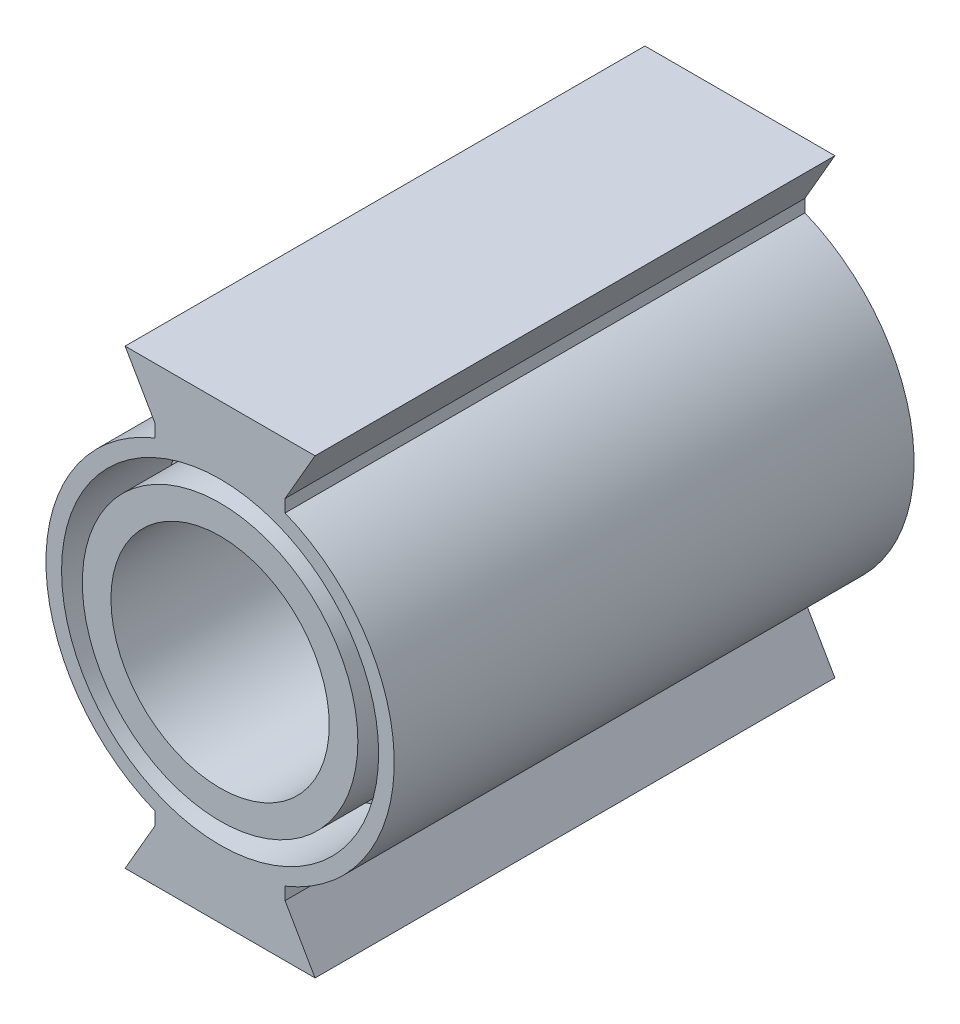
ISO-10303-21;
HEADER;
FILE_DESCRIPTION(('STEP AP214'),'2;1');
FILE_NAME('part.step','',(''),(''),'','','');
FILE_SCHEMA(('AUTOMOTIVE_DESIGN { 1 0 10303 214 1 1 1 1 }'));
ENDSEC;
DATA;
#1=APPLICATION_CONTEXT('core data for automotive mechanical design processes');
#2=APPLICATION_PROTOCOL_DEFINITION('international standard','automotive_design',2000,#1);
#3=PRODUCT_CONTEXT('',#1,'mechanical');
#4=PRODUCT('Part','Part','',(#3));
#5=PRODUCT_RELATED_PRODUCT_CATEGORY('part','',(#4));
#6=PRODUCT_DEFINITION_FORMATION('','',#4);
#7=PRODUCT_DEFINITION_CONTEXT('part definition',#1,'design');
#8=PRODUCT_DEFINITION('design','',#6,#7);
#9=PRODUCT_DEFINITION_SHAPE('','',#8);
#10=(LENGTH_UNIT() NAMED_UNIT(*) SI_UNIT(.MILLI.,.METRE.));
#11=(NAMED_UNIT(*) PLANE_ANGLE_UNIT() SI_UNIT($,.RADIAN.));
#12=(NAMED_UNIT(*) SI_UNIT($,.STERADIAN.) SOLID_ANGLE_UNIT());
#13=UNCERTAINTY_MEASURE_WITH_UNIT(LENGTH_MEASURE(1.E-05),#10,'distance_accuracy_value','');
#14=(GEOMETRIC_REPRESENTATION_CONTEXT(3) GLOBAL_UNCERTAINTY_ASSIGNED_CONTEXT((#13)) GLOBAL_UNIT_ASSIGNED_CONTEXT((#10,
#11,#12)) REPRESENTATION_CONTEXT('',''));
#15=CARTESIAN_POINT('',(0.,0.,0.));
#16=DIRECTION('',(0.,0.,1.));
#17=DIRECTION('',(1.,0.,0.));
#18=AXIS2_PLACEMENT_3D('',#15,#16,#17);
#19=CARTESIAN_POINT('',(0.,0.,25.4));
#20=DIRECTION('',(0.,0.,-1.));
#21=DIRECTION('',(-1.,0.,0.));
#22=AXIS2_PLACEMENT_3D('',#19,#20,#21);
#23=CYLINDRICAL_SURFACE('',#22,8.509);
#24=CARTESIAN_POINT('',(0.,0.,25.4));
#25=DIRECTION('',(0.,0.,1.));
#26=DIRECTION('',(1.,0.,0.));
#27=AXIS2_PLACEMENT_3D('',#24,#25,#26);
#28=CIRCLE('',#27,8.509);
#29=CARTESIAN_POINT('',(3.175,-7.89445729610339,25.4));
#30=VERTEX_POINT('',#29);
#31=CARTESIAN_POINT('',(3.175,7.89445729610339,25.4));
#32=VERTEX_POINT('',#31);
#33=EDGE_CURVE('E42',#30,#32,#28,.T.);
#34=ORIENTED_EDGE('',*,*,#33,.F.);
#35=DIRECTION('',(0.,0.,-1.));
#36=VECTOR('',#35,1.);
#37=CARTESIAN_POINT('',(3.175,-7.89445729610339,35.2042900289148));
#38=LINE('',#37,#36);
#39=CARTESIAN_POINT('',(3.175,-7.89445729610339,0.));
#40=VERTEX_POINT('',#39);
#41=EDGE_CURVE('E144',#30,#40,#38,.T.);
#42=ORIENTED_EDGE('',*,*,#41,.T.);
#43=CARTESIAN_POINT('',(0.,0.,0.));
#44=DIRECTION('',(0.,0.,1.));
#45=DIRECTION('',(1.,0.,0.));
#46=AXIS2_PLACEMENT_3D('',#43,#44,#45);
#47=CIRCLE('',#46,8.509);
#48=CARTESIAN_POINT('',(3.175,7.89445729610339,0.));
#49=VERTEX_POINT('',#48);
#50=EDGE_CURVE('E224',#40,#49,#47,.T.);
#51=ORIENTED_EDGE('',*,*,#50,.T.);
#52=DIRECTION('',(0.,0.,-1.));
#53=VECTOR('',#52,1.);
#54=CARTESIAN_POINT('',(3.175,7.89445729610339,35.2042900289148));
#55=LINE('',#54,#53);
#56=EDGE_CURVE('E186',#32,#49,#55,.T.);
#57=ORIENTED_EDGE('',*,*,#56,.F.);
#58=EDGE_LOOP('',(#34,#42,#51,#57));
#59=FACE_BOUND('',#58,.T.);
#60=ADVANCED_FACE('F33',(#59),#23,.T.);
#61=CARTESIAN_POINT('',(-3.175,7.89445729610339,0.));
#62=VERTEX_POINT('',#61);
#63=CARTESIAN_POINT('',(-3.175,-7.89445729610339,0.));
#64=VERTEX_POINT('',#63);
#65=EDGE_CURVE('E37',#62,#64,#47,.T.);
#66=ORIENTED_EDGE('',*,*,#65,.T.);
#67=DIRECTION('',(0.,0.,-1.));
#68=VECTOR('',#67,1.);
#69=CARTESIAN_POINT('',(-3.175,-7.89445729610339,35.2042900289148));
#70=LINE('',#69,#68);
#71=CARTESIAN_POINT('',(-3.175,-7.89445729610339,25.4));
#72=VERTEX_POINT('',#71);
#73=EDGE_CURVE('E56',#72,#64,#70,.T.);
#74=ORIENTED_EDGE('',*,*,#73,.F.);
#75=CARTESIAN_POINT('',(-3.175,7.89445729610339,25.4));
#76=VERTEX_POINT('',#75);
#77=EDGE_CURVE('E11',#76,#72,#28,.T.);
#78=ORIENTED_EDGE('',*,*,#77,.F.);
#79=DIRECTION('',(0.,0.,-1.));
#80=VECTOR('',#79,1.);
#81=CARTESIAN_POINT('',(-3.175,7.89445729610339,35.2042900289148));
#82=LINE('',#81,#80);
#83=EDGE_CURVE('E166',#76,#62,#82,.T.);
#84=ORIENTED_EDGE('',*,*,#83,.T.);
#85=EDGE_LOOP('',(#66,#74,#78,#84));
#86=FACE_BOUND('',#85,.T.);
#87=ADVANCED_FACE('F35',(#86),#23,.T.);
#88=CARTESIAN_POINT('',(0.,0.,25.4));
#89=DIRECTION('',(0.,0.,1.));
#90=DIRECTION('',(1.,0.,0.));
#91=AXIS2_PLACEMENT_3D('',#88,#89,#90);
#92=PLANE('',#91);
#93=CARTESIAN_POINT('',(0.,0.,25.4));
#94=DIRECTION('',(0.,0.,1.));
#95=DIRECTION('',(1.,0.,0.));
#96=AXIS2_PLACEMENT_3D('',#93,#94,#95);
#97=CIRCLE('',#96,5.334);
#98=CARTESIAN_POINT('',(5.334,0.,25.4));
#99=VERTEX_POINT('',#98);
#100=EDGE_CURVE('E221',#99,#99,#97,.T.);
#101=ORIENTED_EDGE('',*,*,#100,.F.);
#102=EDGE_LOOP('',(#101));
#103=FACE_BOUND('',#102,.T.);
#104=CARTESIAN_POINT('',(0.,0.,25.4));
#105=DIRECTION('',(0.,0.,1.));
#106=DIRECTION('',(1.,0.,0.));
#107=AXIS2_PLACEMENT_3D('',#104,#105,#106);
#108=CIRCLE('',#107,6.731);
#109=CARTESIAN_POINT('',(6.731,0.,25.4));
#110=VERTEX_POINT('',#109);
#111=EDGE_CURVE('E190',#110,#110,#108,.T.);
#112=ORIENTED_EDGE('',*,*,#111,.T.);
#113=EDGE_LOOP('',(#112));
#114=FACE_BOUND('',#113,.T.);
#115=ADVANCED_FACE('F248',(#103,#114),#92,.T.);
#116=CARTESIAN_POINT('',(0.,0.,25.4));
#117=DIRECTION('',(0.,0.,1.));
#118=DIRECTION('',(1.,0.,0.));
#119=AXIS2_PLACEMENT_3D('',#116,#117,#118);
#120=CIRCLE('',#119,7.747);
#121=CARTESIAN_POINT('',(7.747,0.,25.4));
#122=VERTEX_POINT('',#121);
#123=EDGE_CURVE('E212',#122,#122,#120,.T.);
#124=ORIENTED_EDGE('',*,*,#123,.F.);
#125=EDGE_LOOP('',(#124));
#126=FACE_BOUND('',#125,.T.);
#127=ORIENTED_EDGE('',*,*,#77,.T.);
#128=DIRECTION('',(0.,1.,0.));
#129=VECTOR('',#128,1.);
#130=CARTESIAN_POINT('',(-3.175,-7.89445729610339,25.4));
#131=LINE('',#130,#129);
#132=CARTESIAN_POINT('',(-3.175,-8.509,25.4));
#133=VERTEX_POINT('',#132);
#134=EDGE_CURVE('E152',#133,#72,#131,.T.);
#135=ORIENTED_EDGE('',*,*,#134,.F.);
#136=DIRECTION('',(0.500000000000005,0.866025403784436,0.));
#137=VECTOR('',#136,1.);
#138=CARTESIAN_POINT('',(-4.64146968374167,-11.049,25.4));
#139=LINE('',#138,#137);
#140=CARTESIAN_POINT('',(-4.64146968374167,-11.049,25.4));
#141=VERTEX_POINT('',#140);
#142=EDGE_CURVE('E156',#141,#133,#139,.T.);
#143=ORIENTED_EDGE('',*,*,#142,.F.);
#144=DIRECTION('',(-1.,0.,0.));
#145=VECTOR('',#144,1.);
#146=CARTESIAN_POINT('',(4.64146968374166,-11.049,25.4));
#147=LINE('',#146,#145);
#148=CARTESIAN_POINT('',(4.64146968374166,-11.049,25.4));
#149=VERTEX_POINT('',#148);
#150=EDGE_CURVE('E129',#149,#141,#147,.T.);
#151=ORIENTED_EDGE('',*,*,#150,.F.);
#152=DIRECTION('',(0.500000000000004,-0.866025403784436,0.));
#153=VECTOR('',#152,1.);
#154=CARTESIAN_POINT('',(3.175,-8.509,25.4));
#155=LINE('',#154,#153);
#156=CARTESIAN_POINT('',(3.175,-8.509,25.4));
#157=VERTEX_POINT('',#156);
#158=EDGE_CURVE('E122',#157,#149,#155,.T.);
#159=ORIENTED_EDGE('',*,*,#158,.F.);
#160=DIRECTION('',(0.,-1.,0.));
#161=VECTOR('',#160,1.);
#162=CARTESIAN_POINT('',(3.175,-7.89445729610339,25.4));
#163=LINE('',#162,#161);
#164=EDGE_CURVE('E126',#30,#157,#163,.T.);
#165=ORIENTED_EDGE('',*,*,#164,.F.);
#166=ORIENTED_EDGE('',*,*,#33,.T.);
#167=DIRECTION('',(0.,1.,0.));
#168=VECTOR('',#167,1.);
#169=CARTESIAN_POINT('',(3.175,7.89445729610339,25.4));
#170=LINE('',#169,#168);
#171=CARTESIAN_POINT('',(3.175,8.509,25.4));
#172=VERTEX_POINT('',#171);
#173=EDGE_CURVE('E197',#32,#172,#170,.T.);
#174=ORIENTED_EDGE('',*,*,#173,.T.);
#175=DIRECTION('',(0.500000000000004,0.866025403784436,0.));
#176=VECTOR('',#175,1.);
#177=CARTESIAN_POINT('',(3.175,8.509,25.4));
#178=LINE('',#177,#176);
#179=CARTESIAN_POINT('',(4.64146968374166,11.049,25.4));
#180=VERTEX_POINT('',#179);
#181=EDGE_CURVE('E194',#172,#180,#178,.T.);
#182=ORIENTED_EDGE('',*,*,#181,.T.);
#183=DIRECTION('',(-1.,0.,0.));
#184=VECTOR('',#183,1.);
#185=CARTESIAN_POINT('',(4.64146968374166,11.049,25.4));
#186=LINE('',#185,#184);
#187=CARTESIAN_POINT('',(-4.64146968374167,11.049,25.4));
#188=VERTEX_POINT('',#187);
#189=EDGE_CURVE('E191',#180,#188,#186,.T.);
#190=ORIENTED_EDGE('',*,*,#189,.T.);
#191=DIRECTION('',(0.500000000000005,-0.866025403784436,0.));
#192=VECTOR('',#191,1.);
#193=CARTESIAN_POINT('',(-4.64146968374167,11.049,25.4));
#194=LINE('',#193,#192);
#195=CARTESIAN_POINT('',(-3.175,8.509,25.4));
#196=VERTEX_POINT('',#195);
#197=EDGE_CURVE('E187',#188,#196,#194,.T.);
#198=ORIENTED_EDGE('',*,*,#197,.T.);
#199=DIRECTION('',(0.,-1.,0.));
#200=VECTOR('',#199,1.);
#201=CARTESIAN_POINT('',(-3.175,7.89445729610339,25.4));
#202=LINE('',#201,#200);
#203=EDGE_CURVE('E169',#196,#76,#202,.T.);
#204=ORIENTED_EDGE('',*,*,#203,.T.);
#205=EDGE_LOOP('',(#127,#135,#143,#151,#159,#165,#166,#174,#182,#190,#198,#204));
#206=FACE_BOUND('',#205,.T.);
#207=ADVANCED_FACE('F124',(#126,#206),#92,.T.);
#208=CARTESIAN_POINT('',(0.,0.,0.));
#209=DIRECTION('',(0.,0.,1.));
#210=DIRECTION('',(1.,0.,0.));
#211=AXIS2_PLACEMENT_3D('',#208,#209,#210);
#212=PLANE('',#211);
#213=ORIENTED_EDGE('',*,*,#65,.F.);
#214=DIRECTION('',(0.,-1.,0.));
#215=VECTOR('',#214,1.);
#216=CARTESIAN_POINT('',(-3.175,7.89445729610339,0.));
#217=LINE('',#216,#215);
#218=CARTESIAN_POINT('',(-3.175,8.509,0.));
#219=VERTEX_POINT('',#218);
#220=EDGE_CURVE('E167',#219,#62,#217,.T.);
#221=ORIENTED_EDGE('',*,*,#220,.F.);
#222=DIRECTION('',(0.500000000000005,-0.866025403784436,0.));
#223=VECTOR('',#222,1.);
#224=CARTESIAN_POINT('',(-4.64146968374167,11.049,0.));
#225=LINE('',#224,#223);
#226=CARTESIAN_POINT('',(-4.64146968374167,11.049,0.));
#227=VERTEX_POINT('',#226);
#228=EDGE_CURVE('E171',#227,#219,#225,.T.);
#229=ORIENTED_EDGE('',*,*,#228,.F.);
#230=DIRECTION('',(-1.,0.,0.));
#231=VECTOR('',#230,1.);
#232=CARTESIAN_POINT('',(4.64146968374166,11.049,0.));
#233=LINE('',#232,#231);
#234=CARTESIAN_POINT('',(4.64146968374166,11.049,0.));
#235=VERTEX_POINT('',#234);
#236=EDGE_CURVE('E175',#235,#227,#233,.T.);
#237=ORIENTED_EDGE('',*,*,#236,.F.);
#238=DIRECTION('',(0.500000000000004,0.866025403784436,0.));
#239=VECTOR('',#238,1.);
#240=CARTESIAN_POINT('',(3.175,8.509,0.));
#241=LINE('',#240,#239);
#242=CARTESIAN_POINT('',(3.175,8.509,0.));
#243=VERTEX_POINT('',#242);
#244=EDGE_CURVE('E179',#243,#235,#241,.T.);
#245=ORIENTED_EDGE('',*,*,#244,.F.);
#246=DIRECTION('',(0.,1.,0.));
#247=VECTOR('',#246,1.);
#248=CARTESIAN_POINT('',(3.175,7.89445729610339,0.));
#249=LINE('',#248,#247);
#250=EDGE_CURVE('E183',#49,#243,#249,.T.);
#251=ORIENTED_EDGE('',*,*,#250,.F.);
#252=ORIENTED_EDGE('',*,*,#50,.F.);
#253=DIRECTION('',(0.,-1.,0.));
#254=VECTOR('',#253,1.);
#255=CARTESIAN_POINT('',(3.175,-7.89445729610339,0.));
#256=LINE('',#255,#254);
#257=CARTESIAN_POINT('',(3.175,-8.509,0.));
#258=VERTEX_POINT('',#257);
#259=EDGE_CURVE('E270',#40,#258,#256,.T.);
#260=ORIENTED_EDGE('',*,*,#259,.T.);
#261=DIRECTION('',(0.500000000000004,-0.866025403784436,0.));
#262=VECTOR('',#261,1.);
#263=CARTESIAN_POINT('',(3.175,-8.509,0.));
#264=LINE('',#263,#262);
#265=CARTESIAN_POINT('',(4.64146968374166,-11.049,0.));
#266=VERTEX_POINT('',#265);
#267=EDGE_CURVE('E138',#258,#266,#264,.T.);
#268=ORIENTED_EDGE('',*,*,#267,.T.);
#269=DIRECTION('',(-1.,0.,0.));
#270=VECTOR('',#269,1.);
#271=CARTESIAN_POINT('',(4.64146968374166,-11.049,0.));
#272=LINE('',#271,#270);
#273=CARTESIAN_POINT('',(-4.64146968374167,-11.049,0.));
#274=VERTEX_POINT('',#273);
#275=EDGE_CURVE('E264',#266,#274,#272,.T.);
#276=ORIENTED_EDGE('',*,*,#275,.T.);
#277=DIRECTION('',(0.500000000000005,0.866025403784436,0.));
#278=VECTOR('',#277,1.);
#279=CARTESIAN_POINT('',(-4.64146968374167,-11.049,0.));
#280=LINE('',#279,#278);
#281=CARTESIAN_POINT('',(-3.175,-8.509,0.));
#282=VERTEX_POINT('',#281);
#283=EDGE_CURVE('E148',#274,#282,#280,.T.);
#284=ORIENTED_EDGE('',*,*,#283,.T.);
#285=DIRECTION('',(0.,1.,0.));
#286=VECTOR('',#285,1.);
#287=CARTESIAN_POINT('',(-3.175,-7.89445729610339,0.));
#288=LINE('',#287,#286);
#289=EDGE_CURVE('E145',#282,#64,#288,.T.);
#290=ORIENTED_EDGE('',*,*,#289,.T.);
#291=EDGE_LOOP('',(#213,#221,#229,#237,#245,#251,#252,#260,#268,#276,#284,#290));
#292=FACE_BOUND('',#291,.T.);
#293=CARTESIAN_POINT('',(0.,0.,0.));
#294=DIRECTION('',(0.,0.,1.));
#295=DIRECTION('',(1.,0.,0.));
#296=AXIS2_PLACEMENT_3D('',#293,#294,#295);
#297=CIRCLE('',#296,5.334);
#298=CARTESIAN_POINT('',(5.334,0.,0.));
#299=VERTEX_POINT('',#298);
#300=EDGE_CURVE('E218',#299,#299,#297,.T.);
#301=ORIENTED_EDGE('',*,*,#300,.T.);
#302=EDGE_LOOP('',(#301));
#303=FACE_BOUND('',#302,.T.);
#304=ADVANCED_FACE('F228',(#292,#303),#212,.F.);
#305=CARTESIAN_POINT('',(0.,0.,25.4));
#306=DIRECTION('',(0.,0.,-1.));
#307=DIRECTION('',(-1.,0.,0.));
#308=AXIS2_PLACEMENT_3D('',#305,#306,#307);
#309=CYLINDRICAL_SURFACE('',#308,5.334);
#310=ORIENTED_EDGE('',*,*,#100,.T.);
#311=EDGE_LOOP('',(#310));
#312=FACE_BOUND('',#311,.T.);
#313=ORIENTED_EDGE('',*,*,#300,.F.);
#314=EDGE_LOOP('',(#313));
#315=FACE_BOUND('',#314,.T.);
#316=ADVANCED_FACE('F230',(#312,#315),#309,.F.);
#317=CARTESIAN_POINT('',(0.,0.,20.32));
#318=DIRECTION('',(0.,0.,1.));
#319=DIRECTION('',(1.,0.,0.));
#320=AXIS2_PLACEMENT_3D('',#317,#318,#319);
#321=CYLINDRICAL_SURFACE('',#320,7.747);
#322=CARTESIAN_POINT('',(0.,0.,20.32));
#323=DIRECTION('',(0.,0.,1.));
#324=DIRECTION('',(1.,0.,0.));
#325=AXIS2_PLACEMENT_3D('',#322,#323,#324);
#326=CIRCLE('',#325,7.747);
#327=CARTESIAN_POINT('',(7.747,0.,20.32));
#328=VERTEX_POINT('',#327);
#329=EDGE_CURVE('E215',#328,#328,#326,.T.);
#330=ORIENTED_EDGE('',*,*,#329,.F.);
#331=EDGE_LOOP('',(#330));
#332=FACE_BOUND('',#331,.T.);
#333=ORIENTED_EDGE('',*,*,#123,.T.);
#334=EDGE_LOOP('',(#333));
#335=FACE_BOUND('',#334,.T.);
#336=ADVANCED_FACE('F232',(#332,#335),#321,.F.);
#337=CARTESIAN_POINT('',(0.,0.,20.32));
#338=DIRECTION('',(0.,0.,1.));
#339=DIRECTION('',(1.,0.,0.));
#340=AXIS2_PLACEMENT_3D('',#337,#338,#339);
#341=PLANE('',#340);
#342=CARTESIAN_POINT('',(0.,0.,20.32));
#343=DIRECTION('',(0.,0.,1.));
#344=DIRECTION('',(1.,0.,0.));
#345=AXIS2_PLACEMENT_3D('',#342,#343,#344);
#346=CIRCLE('',#345,6.731);
#347=CARTESIAN_POINT('',(6.731,0.,20.32));
#348=VERTEX_POINT('',#347);
#349=EDGE_CURVE('E209',#348,#348,#346,.T.);
#350=ORIENTED_EDGE('',*,*,#349,.F.);
#351=EDGE_LOOP('',(#350));
#352=FACE_BOUND('',#351,.T.);
#353=ORIENTED_EDGE('',*,*,#329,.T.);
#354=EDGE_LOOP('',(#353));
#355=FACE_BOUND('',#354,.T.);
#356=ADVANCED_FACE('F239',(#352,#355),#341,.T.);
#357=CARTESIAN_POINT('',(0.,0.,20.32));
#358=DIRECTION('',(0.,0.,1.));
#359=DIRECTION('',(1.,0.,0.));
#360=AXIS2_PLACEMENT_3D('',#357,#358,#359);
#361=CYLINDRICAL_SURFACE('',#360,6.731);
#362=ORIENTED_EDGE('',*,*,#349,.T.);
#363=EDGE_LOOP('',(#362));
#364=FACE_BOUND('',#363,.T.);
#365=ORIENTED_EDGE('',*,*,#111,.F.);
#366=EDGE_LOOP('',(#365));
#367=FACE_BOUND('',#366,.T.);
#368=ADVANCED_FACE('F306',(#364,#367),#361,.T.);
#369=CARTESIAN_POINT('',(3.175,7.89445729610339,35.2042900289148));
#370=DIRECTION('',(-1.,0.,0.));
#371=DIRECTION('',(0.,0.,1.));
#372=AXIS2_PLACEMENT_3D('',#369,#370,#371);
#373=PLANE('',#372);
#374=ORIENTED_EDGE('',*,*,#173,.F.);
#375=ORIENTED_EDGE('',*,*,#56,.T.);
#376=ORIENTED_EDGE('',*,*,#250,.T.);
#377=DIRECTION('',(0.,0.,-1.));
#378=VECTOR('',#377,1.);
#379=CARTESIAN_POINT('',(3.175,8.509,35.2042900289148));
#380=LINE('',#379,#378);
#381=EDGE_CURVE('E182',#172,#243,#380,.T.);
#382=ORIENTED_EDGE('',*,*,#381,.F.);
#383=EDGE_LOOP('',(#374,#375,#376,#382));
#384=FACE_BOUND('',#383,.T.);
#385=ADVANCED_FACE('F275',(#384),#373,.F.);
#386=CARTESIAN_POINT('',(3.175,8.509,35.2042900289148));
#387=DIRECTION('',(-0.866025403784436,0.500000000000004,0.));
#388=DIRECTION('',(-0.500000000000004,-0.866025403784436,0.));
#389=AXIS2_PLACEMENT_3D('',#386,#387,#388);
#390=PLANE('',#389);
#391=ORIENTED_EDGE('',*,*,#181,.F.);
#392=ORIENTED_EDGE('',*,*,#381,.T.);
#393=ORIENTED_EDGE('',*,*,#244,.T.);
#394=DIRECTION('',(0.,0.,-1.));
#395=VECTOR('',#394,1.);
#396=CARTESIAN_POINT('',(4.64146968374166,11.049,35.2042900289148));
#397=LINE('',#396,#395);
#398=EDGE_CURVE('E178',#180,#235,#397,.T.);
#399=ORIENTED_EDGE('',*,*,#398,.F.);
#400=EDGE_LOOP('',(#391,#392,#393,#399));
#401=FACE_BOUND('',#400,.T.);
#402=ADVANCED_FACE('F279',(#401),#390,.F.);
#403=CARTESIAN_POINT('',(4.64146968374166,11.049,35.2042900289148));
#404=DIRECTION('',(0.,-1.,0.));
#405=DIRECTION('',(1.,0.,0.));
#406=AXIS2_PLACEMENT_3D('',#403,#404,#405);
#407=PLANE('',#406);
#408=ORIENTED_EDGE('',*,*,#189,.F.);
#409=ORIENTED_EDGE('',*,*,#398,.T.);
#410=ORIENTED_EDGE('',*,*,#236,.T.);
#411=DIRECTION('',(0.,0.,-1.));
#412=VECTOR('',#411,1.);
#413=CARTESIAN_POINT('',(-4.64146968374167,11.049,35.2042900289148));
#414=LINE('',#413,#412);
#415=EDGE_CURVE('E174',#188,#227,#414,.T.);
#416=ORIENTED_EDGE('',*,*,#415,.F.);
#417=EDGE_LOOP('',(#408,#409,#410,#416));
#418=FACE_BOUND('',#417,.T.);
#419=ADVANCED_FACE('F282',(#418),#407,.F.);
#420=CARTESIAN_POINT('',(-4.64146968374167,11.049,35.2042900289148));
#421=DIRECTION('',(0.866025403784436,0.500000000000005,0.));
#422=DIRECTION('',(-0.500000000000005,0.866025403784436,0.));
#423=AXIS2_PLACEMENT_3D('',#420,#421,#422);
#424=PLANE('',#423);
#425=ORIENTED_EDGE('',*,*,#197,.F.);
#426=ORIENTED_EDGE('',*,*,#415,.T.);
#427=ORIENTED_EDGE('',*,*,#228,.T.);
#428=DIRECTION('',(0.,0.,-1.));
#429=VECTOR('',#428,1.);
#430=CARTESIAN_POINT('',(-3.175,8.509,35.2042900289148));
#431=LINE('',#430,#429);
#432=EDGE_CURVE('E170',#196,#219,#431,.T.);
#433=ORIENTED_EDGE('',*,*,#432,.F.);
#434=EDGE_LOOP('',(#425,#426,#427,#433));
#435=FACE_BOUND('',#434,.T.);
#436=ADVANCED_FACE('F286',(#435),#424,.F.);
#437=CARTESIAN_POINT('',(-3.175,7.89445729610339,35.2042900289148));
#438=DIRECTION('',(1.,0.,0.));
#439=DIRECTION('',(0.,0.,-1.));
#440=AXIS2_PLACEMENT_3D('',#437,#438,#439);
#441=PLANE('',#440);
#442=ORIENTED_EDGE('',*,*,#203,.F.);
#443=ORIENTED_EDGE('',*,*,#432,.T.);
#444=ORIENTED_EDGE('',*,*,#220,.T.);
#445=ORIENTED_EDGE('',*,*,#83,.F.);
#446=EDGE_LOOP('',(#442,#443,#444,#445));
#447=FACE_BOUND('',#446,.T.);
#448=ADVANCED_FACE('F289',(#447),#441,.F.);
#449=CARTESIAN_POINT('',(3.175,-7.89445729610339,35.2042900289148));
#450=DIRECTION('',(1.,0.,0.));
#451=DIRECTION('',(0.,0.,-1.));
#452=AXIS2_PLACEMENT_3D('',#449,#450,#451);
#453=PLANE('',#452);
#454=ORIENTED_EDGE('',*,*,#41,.F.);
#455=ORIENTED_EDGE('',*,*,#164,.T.);
#456=DIRECTION('',(0.,0.,-1.));
#457=VECTOR('',#456,1.);
#458=CARTESIAN_POINT('',(3.175,-8.509,35.2042900289148));
#459=LINE('',#458,#457);
#460=EDGE_CURVE('E133',#157,#258,#459,.T.);
#461=ORIENTED_EDGE('',*,*,#460,.T.);
#462=ORIENTED_EDGE('',*,*,#259,.F.);
#463=EDGE_LOOP('',(#454,#455,#461,#462));
#464=FACE_BOUND('',#463,.T.);
#465=ADVANCED_FACE('F143',(#464),#453,.T.);
#466=CARTESIAN_POINT('',(3.175,-8.509,35.2042900289148));
#467=DIRECTION('',(0.866025403784436,0.500000000000004,0.));
#468=DIRECTION('',(-0.500000000000004,0.866025403784436,0.));
#469=AXIS2_PLACEMENT_3D('',#466,#467,#468);
#470=PLANE('',#469);
#471=ORIENTED_EDGE('',*,*,#460,.F.);
#472=ORIENTED_EDGE('',*,*,#158,.T.);
#473=DIRECTION('',(0.,0.,-1.));
#474=VECTOR('',#473,1.);
#475=CARTESIAN_POINT('',(4.64146968374166,-11.049,35.2042900289148));
#476=LINE('',#475,#474);
#477=EDGE_CURVE('E132',#149,#266,#476,.T.);
#478=ORIENTED_EDGE('',*,*,#477,.T.);
#479=ORIENTED_EDGE('',*,*,#267,.F.);
#480=EDGE_LOOP('',(#471,#472,#478,#479));
#481=FACE_BOUND('',#480,.T.);
#482=ADVANCED_FACE('F136',(#481),#470,.T.);
#483=CARTESIAN_POINT('',(4.64146968374166,-11.049,35.2042900289148));
#484=DIRECTION('',(0.,-1.,0.));
#485=DIRECTION('',(1.,0.,0.));
#486=AXIS2_PLACEMENT_3D('',#483,#484,#485);
#487=PLANE('',#486);
#488=ORIENTED_EDGE('',*,*,#477,.F.);
#489=ORIENTED_EDGE('',*,*,#150,.T.);
#490=DIRECTION('',(0.,0.,-1.));
#491=VECTOR('',#490,1.);
#492=CARTESIAN_POINT('',(-4.64146968374167,-11.049,35.2042900289148));
#493=LINE('',#492,#491);
#494=EDGE_CURVE('E159',#141,#274,#493,.T.);
#495=ORIENTED_EDGE('',*,*,#494,.T.);
#496=ORIENTED_EDGE('',*,*,#275,.F.);
#497=EDGE_LOOP('',(#488,#489,#495,#496));
#498=FACE_BOUND('',#497,.T.);
#499=ADVANCED_FACE('F345',(#498),#487,.T.);
#500=CARTESIAN_POINT('',(-4.64146968374167,-11.049,35.2042900289148));
#501=DIRECTION('',(-0.866025403784436,0.500000000000005,0.));
#502=DIRECTION('',(-0.500000000000005,-0.866025403784436,0.));
#503=AXIS2_PLACEMENT_3D('',#500,#501,#502);
#504=PLANE('',#503);
#505=ORIENTED_EDGE('',*,*,#494,.F.);
#506=ORIENTED_EDGE('',*,*,#142,.T.);
#507=DIRECTION('',(0.,0.,-1.));
#508=VECTOR('',#507,1.);
#509=CARTESIAN_POINT('',(-3.175,-8.509,35.2042900289148));
#510=LINE('',#509,#508);
#511=EDGE_CURVE('E155',#133,#282,#510,.T.);
#512=ORIENTED_EDGE('',*,*,#511,.T.);
#513=ORIENTED_EDGE('',*,*,#283,.F.);
#514=EDGE_LOOP('',(#505,#506,#512,#513));
#515=FACE_BOUND('',#514,.T.);
#516=ADVANCED_FACE('F353',(#515),#504,.T.);
#517=CARTESIAN_POINT('',(-3.175,-7.89445729610339,35.2042900289148));
#518=DIRECTION('',(-1.,0.,0.));
#519=DIRECTION('',(0.,0.,1.));
#520=AXIS2_PLACEMENT_3D('',#517,#518,#519);
#521=PLANE('',#520);
#522=ORIENTED_EDGE('',*,*,#511,.F.);
#523=ORIENTED_EDGE('',*,*,#134,.T.);
#524=ORIENTED_EDGE('',*,*,#73,.T.);
#525=ORIENTED_EDGE('',*,*,#289,.F.);
#526=EDGE_LOOP('',(#522,#523,#524,#525));
#527=FACE_BOUND('',#526,.T.);
#528=ADVANCED_FACE('F259',(#527),#521,.T.);
#529=CLOSED_SHELL('',(#60,#87,#115,#207,#304,#316,#336,#356,#368,#385,#402,#419,#436,#448,#465,
#482,#499,#516,#528));
#530=MANIFOLD_SOLID_BREP('B2',#529);
#531=ADVANCED_BREP_SHAPE_REPRESENTATION('',(#18,#530),#14);
#532=SHAPE_DEFINITION_REPRESENTATION(#9,#531);
ENDSEC;
END-ISO-10303-21;
